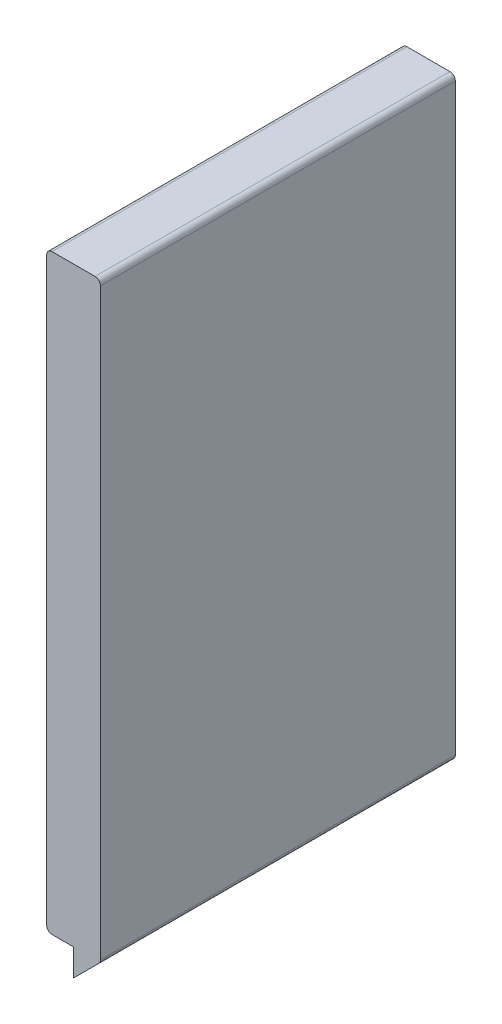
ISO-10303-21;
HEADER;
FILE_DESCRIPTION(('STEP AP214'),'2;1');
FILE_NAME('part.step','',(''),(''),'','','');
FILE_SCHEMA(('AUTOMOTIVE_DESIGN { 1 0 10303 214 1 1 1 1 }'));
ENDSEC;
DATA;
#1=APPLICATION_CONTEXT('core data for automotive mechanical design processes');
#2=APPLICATION_PROTOCOL_DEFINITION('international standard','automotive_design',2000,#1);
#3=PRODUCT_CONTEXT('',#1,'mechanical');
#4=PRODUCT('Part','Part','',(#3));
#5=PRODUCT_RELATED_PRODUCT_CATEGORY('part','',(#4));
#6=PRODUCT_DEFINITION_FORMATION('','',#4);
#7=PRODUCT_DEFINITION_CONTEXT('part definition',#1,'design');
#8=PRODUCT_DEFINITION('design','',#6,#7);
#9=PRODUCT_DEFINITION_SHAPE('','',#8);
#10=(LENGTH_UNIT() NAMED_UNIT(*) SI_UNIT(.MILLI.,.METRE.));
#11=(NAMED_UNIT(*) PLANE_ANGLE_UNIT() SI_UNIT($,.RADIAN.));
#12=(NAMED_UNIT(*) SI_UNIT($,.STERADIAN.) SOLID_ANGLE_UNIT());
#13=UNCERTAINTY_MEASURE_WITH_UNIT(LENGTH_MEASURE(1.E-05),#10,'distance_accuracy_value','');
#14=(GEOMETRIC_REPRESENTATION_CONTEXT(3) GLOBAL_UNCERTAINTY_ASSIGNED_CONTEXT((#13)) GLOBAL_UNIT_ASSIGNED_CONTEXT((#10,
#11,#12)) REPRESENTATION_CONTEXT('',''));
#15=CARTESIAN_POINT('',(0.,0.,0.));
#16=DIRECTION('',(0.,0.,1.));
#17=DIRECTION('',(1.,0.,0.));
#18=AXIS2_PLACEMENT_3D('',#15,#16,#17);
#19=CARTESIAN_POINT('',(10.,-55.,33.));
#20=DIRECTION('',(-1.,0.,0.));
#21=DIRECTION('',(0.,-1.,0.));
#22=AXIS2_PLACEMENT_3D('',#19,#20,#21);
#23=PLANE('',#22);
#24=DIRECTION('',(0.,1.,0.));
#25=VECTOR('',#24,1.);
#26=CARTESIAN_POINT('',(10.,-55.,-33.));
#27=LINE('',#26,#25);
#28=CARTESIAN_POINT('',(10.,-54.5857864376269,-33.));
#29=VERTEX_POINT('',#28);
#30=CARTESIAN_POINT('',(10.,54.,-33.));
#31=VERTEX_POINT('',#30);
#32=EDGE_CURVE('E149',#29,#31,#27,.T.);
#33=ORIENTED_EDGE('',*,*,#32,.T.);
#34=DIRECTION('',(0.,0.,-1.));
#35=VECTOR('',#34,1.);
#36=CARTESIAN_POINT('',(10.,54.,33.));
#37=LINE('',#36,#35);
#38=CARTESIAN_POINT('',(10.,54.,33.));
#39=VERTEX_POINT('',#38);
#40=EDGE_CURVE('E194',#31,#39,#37,.F.);
#41=ORIENTED_EDGE('',*,*,#40,.T.);
#42=DIRECTION('',(0.,1.,0.));
#43=VECTOR('',#42,1.);
#44=CARTESIAN_POINT('',(10.,-55.,33.));
#45=LINE('',#44,#43);
#46=CARTESIAN_POINT('',(10.,-54.5857864376269,33.));
#47=VERTEX_POINT('',#46);
#48=EDGE_CURVE('E169',#47,#39,#45,.T.);
#49=ORIENTED_EDGE('',*,*,#48,.F.);
#50=DIRECTION('',(0.,0.,-1.));
#51=VECTOR('',#50,1.);
#52=CARTESIAN_POINT('',(10.,-54.5857864376269,33.));
#53=LINE('',#52,#51);
#54=EDGE_CURVE('E190',#47,#29,#53,.T.);
#55=ORIENTED_EDGE('',*,*,#54,.T.);
#56=EDGE_LOOP('',(#33,#41,#49,#55));
#57=FACE_BOUND('',#56,.T.);
#58=ADVANCED_FACE('F39',(#57),#23,.F.);
#59=CARTESIAN_POINT('',(10.,55.,33.));
#60=DIRECTION('',(0.,-1.,0.));
#61=DIRECTION('',(0.,0.,-1.));
#62=AXIS2_PLACEMENT_3D('',#59,#60,#61);
#63=PLANE('',#62);
#64=DIRECTION('',(-1.,0.,0.));
#65=VECTOR('',#64,1.);
#66=CARTESIAN_POINT('',(10.,55.,33.));
#67=LINE('',#66,#65);
#68=CARTESIAN_POINT('',(9.00000000000001,55.,33.));
#69=VERTEX_POINT('',#68);
#70=CARTESIAN_POINT('',(0.999999999999975,55.,33.));
#71=VERTEX_POINT('',#70);
#72=EDGE_CURVE('E228',#69,#71,#67,.T.);
#73=ORIENTED_EDGE('',*,*,#72,.F.);
#74=DIRECTION('',(0.,0.,-1.));
#75=VECTOR('',#74,1.);
#76=CARTESIAN_POINT('',(9.00000000000001,55.,33.));
#77=LINE('',#76,#75);
#78=CARTESIAN_POINT('',(9.00000000000001,55.,-33.));
#79=VERTEX_POINT('',#78);
#80=EDGE_CURVE('E174',#69,#79,#77,.T.);
#81=ORIENTED_EDGE('',*,*,#80,.T.);
#82=DIRECTION('',(-1.,0.,0.));
#83=VECTOR('',#82,1.);
#84=CARTESIAN_POINT('',(10.,55.,-33.));
#85=LINE('',#84,#83);
#86=CARTESIAN_POINT('',(0.999999999999975,55.,-33.));
#87=VERTEX_POINT('',#86);
#88=EDGE_CURVE('E153',#79,#87,#85,.T.);
#89=ORIENTED_EDGE('',*,*,#88,.T.);
#90=DIRECTION('',(0.,0.,-1.));
#91=VECTOR('',#90,1.);
#92=CARTESIAN_POINT('',(0.999999999999975,55.,33.));
#93=LINE('',#92,#91);
#94=EDGE_CURVE('E137',#87,#71,#93,.F.);
#95=ORIENTED_EDGE('',*,*,#94,.T.);
#96=EDGE_LOOP('',(#73,#81,#89,#95));
#97=FACE_BOUND('',#96,.T.);
#98=ADVANCED_FACE('F244',(#97),#63,.F.);
#99=CARTESIAN_POINT('',(0.,55.,33.));
#100=DIRECTION('',(1.,0.,0.));
#101=DIRECTION('',(0.,1.,0.));
#102=AXIS2_PLACEMENT_3D('',#99,#100,#101);
#103=PLANE('',#102);
#104=DIRECTION('',(0.,-1.,0.));
#105=VECTOR('',#104,1.);
#106=CARTESIAN_POINT('',(0.,55.,33.));
#107=LINE('',#106,#105);
#108=CARTESIAN_POINT('',(0.,54.,33.));
#109=VERTEX_POINT('',#108);
#110=CARTESIAN_POINT('',(0.,-54.,33.));
#111=VERTEX_POINT('',#110);
#112=EDGE_CURVE('E127',#109,#111,#107,.T.);
#113=ORIENTED_EDGE('',*,*,#112,.F.);
#114=DIRECTION('',(0.,0.,-1.));
#115=VECTOR('',#114,1.);
#116=CARTESIAN_POINT('',(0.,54.,33.));
#117=LINE('',#116,#115);
#118=CARTESIAN_POINT('',(0.,54.,-33.));
#119=VERTEX_POINT('',#118);
#120=EDGE_CURVE('E48',#109,#119,#117,.T.);
#121=ORIENTED_EDGE('',*,*,#120,.T.);
#122=DIRECTION('',(0.,-1.,0.));
#123=VECTOR('',#122,1.);
#124=CARTESIAN_POINT('',(0.,55.,-33.));
#125=LINE('',#124,#123);
#126=CARTESIAN_POINT('',(0.,-54.,-33.));
#127=VERTEX_POINT('',#126);
#128=EDGE_CURVE('E157',#119,#127,#125,.T.);
#129=ORIENTED_EDGE('',*,*,#128,.T.);
#130=DIRECTION('',(0.,0.,-1.));
#131=VECTOR('',#130,1.);
#132=CARTESIAN_POINT('',(0.,-54.,33.));
#133=LINE('',#132,#131);
#134=EDGE_CURVE('E210',#127,#111,#133,.F.);
#135=ORIENTED_EDGE('',*,*,#134,.T.);
#136=EDGE_LOOP('',(#113,#121,#129,#135));
#137=FACE_BOUND('',#136,.T.);
#138=ADVANCED_FACE('F218',(#137),#103,.F.);
#139=CARTESIAN_POINT('',(0.,-55.,33.));
#140=DIRECTION('',(0.,1.,0.));
#141=DIRECTION('',(0.,0.,1.));
#142=AXIS2_PLACEMENT_3D('',#139,#140,#141);
#143=PLANE('',#142);
#144=DIRECTION('',(1.,0.,0.));
#145=VECTOR('',#144,1.);
#146=CARTESIAN_POINT('',(0.,-55.,33.));
#147=LINE('',#146,#145);
#148=CARTESIAN_POINT('',(1.00000000000001,-55.,33.));
#149=VERTEX_POINT('',#148);
#150=CARTESIAN_POINT('',(5.00000000000001,-55.,33.));
#151=VERTEX_POINT('',#150);
#152=EDGE_CURVE('E117',#149,#151,#147,.T.);
#153=ORIENTED_EDGE('',*,*,#152,.F.);
#154=DIRECTION('',(0.,0.,-1.));
#155=VECTOR('',#154,1.);
#156=CARTESIAN_POINT('',(1.00000000000001,-55.,33.));
#157=LINE('',#156,#155);
#158=CARTESIAN_POINT('',(1.00000000000001,-55.,-33.));
#159=VERTEX_POINT('',#158);
#160=EDGE_CURVE('E11',#149,#159,#157,.T.);
#161=ORIENTED_EDGE('',*,*,#160,.T.);
#162=DIRECTION('',(1.,0.,0.));
#163=VECTOR('',#162,1.);
#164=CARTESIAN_POINT('',(0.,-55.,-33.));
#165=LINE('',#164,#163);
#166=CARTESIAN_POINT('',(5.00000000000001,-55.,-33.));
#167=VERTEX_POINT('',#166);
#168=EDGE_CURVE('E133',#159,#167,#165,.T.);
#169=ORIENTED_EDGE('',*,*,#168,.T.);
#170=DIRECTION('',(0.,0.,-1.));
#171=VECTOR('',#170,1.);
#172=CARTESIAN_POINT('',(5.00000000000001,-55.,33.));
#173=LINE('',#172,#171);
#174=EDGE_CURVE('E130',#151,#167,#173,.T.);
#175=ORIENTED_EDGE('',*,*,#174,.F.);
#176=EDGE_LOOP('',(#153,#161,#169,#175));
#177=FACE_BOUND('',#176,.T.);
#178=ADVANCED_FACE('F131',(#177),#143,.F.);
#179=CARTESIAN_POINT('',(5.00000000000001,-55.,33.));
#180=DIRECTION('',(1.,0.,0.));
#181=DIRECTION('',(0.,1.,0.));
#182=AXIS2_PLACEMENT_3D('',#179,#180,#181);
#183=PLANE('',#182);
#184=DIRECTION('',(0.,-1.,0.));
#185=VECTOR('',#184,1.);
#186=CARTESIAN_POINT('',(5.00000000000001,-55.,-33.));
#187=LINE('',#186,#185);
#188=CARTESIAN_POINT('',(5.00000000000001,-60.,-33.));
#189=VERTEX_POINT('',#188);
#190=EDGE_CURVE('E163',#167,#189,#187,.T.);
#191=ORIENTED_EDGE('',*,*,#190,.T.);
#192=DIRECTION('',(0.,0.,-1.));
#193=VECTOR('',#192,1.);
#194=CARTESIAN_POINT('',(5.00000000000001,-60.,33.));
#195=LINE('',#194,#193);
#196=CARTESIAN_POINT('',(5.00000000000001,-60.,33.));
#197=VERTEX_POINT('',#196);
#198=EDGE_CURVE('E138',#197,#189,#195,.T.);
#199=ORIENTED_EDGE('',*,*,#198,.F.);
#200=DIRECTION('',(0.,-1.,0.));
#201=VECTOR('',#200,1.);
#202=CARTESIAN_POINT('',(5.00000000000001,-55.,33.));
#203=LINE('',#202,#201);
#204=EDGE_CURVE('E122',#151,#197,#203,.T.);
#205=ORIENTED_EDGE('',*,*,#204,.F.);
#206=ORIENTED_EDGE('',*,*,#174,.T.);
#207=EDGE_LOOP('',(#191,#199,#205,#206));
#208=FACE_BOUND('',#207,.T.);
#209=ADVANCED_FACE('F140',(#208),#183,.F.);
#210=CARTESIAN_POINT('',(5.00000000000001,-60.,33.));
#211=DIRECTION('',(-0.707106781186546,0.707106781186549,0.));
#212=DIRECTION('',(-0.707106781186549,-0.707106781186546,0.));
#213=AXIS2_PLACEMENT_3D('',#210,#211,#212);
#214=PLANE('',#213);
#215=DIRECTION('',(0.707106781186549,0.707106781186546,0.));
#216=VECTOR('',#215,1.);
#217=CARTESIAN_POINT('',(5.00000000000001,-60.,-33.));
#218=LINE('',#217,#216);
#219=CARTESIAN_POINT('',(9.70710678118655,-55.2928932188135,-33.));
#220=VERTEX_POINT('',#219);
#221=EDGE_CURVE('E166',#189,#220,#218,.T.);
#222=ORIENTED_EDGE('',*,*,#221,.T.);
#223=DIRECTION('',(0.,0.,-1.));
#224=VECTOR('',#223,1.);
#225=CARTESIAN_POINT('',(9.70710678118655,-55.2928932188135,33.));
#226=LINE('',#225,#224);
#227=CARTESIAN_POINT('',(9.70710678118655,-55.2928932188135,33.));
#228=VERTEX_POINT('',#227);
#229=EDGE_CURVE('E55',#220,#228,#226,.F.);
#230=ORIENTED_EDGE('',*,*,#229,.T.);
#231=DIRECTION('',(0.707106781186549,0.707106781186546,0.));
#232=VECTOR('',#231,1.);
#233=CARTESIAN_POINT('',(5.00000000000001,-60.,33.));
#234=LINE('',#233,#232);
#235=EDGE_CURVE('E143',#197,#228,#234,.T.);
#236=ORIENTED_EDGE('',*,*,#235,.F.);
#237=ORIENTED_EDGE('',*,*,#198,.T.);
#238=EDGE_LOOP('',(#222,#230,#236,#237));
#239=FACE_BOUND('',#238,.T.);
#240=ADVANCED_FACE('F250',(#239),#214,.F.);
#241=CARTESIAN_POINT('',(0.,0.,33.));
#242=DIRECTION('',(0.,0.,1.));
#243=DIRECTION('',(1.,0.,0.));
#244=AXIS2_PLACEMENT_3D('',#241,#242,#243);
#245=PLANE('',#244);
#246=ORIENTED_EDGE('',*,*,#48,.T.);
#247=CARTESIAN_POINT('',(9.00000000000001,54.,33.));
#248=DIRECTION('',(0.,0.,1.));
#249=DIRECTION('',(1.,0.,0.));
#250=AXIS2_PLACEMENT_3D('',#247,#248,#249);
#251=CIRCLE('',#250,1.);
#252=EDGE_CURVE('E205',#39,#69,#251,.T.);
#253=ORIENTED_EDGE('',*,*,#252,.T.);
#254=ORIENTED_EDGE('',*,*,#72,.T.);
#255=CARTESIAN_POINT('',(0.999999999999975,54.,33.));
#256=DIRECTION('',(0.,0.,1.));
#257=DIRECTION('',(1.,0.,0.));
#258=AXIS2_PLACEMENT_3D('',#255,#256,#257);
#259=CIRCLE('',#258,1.);
#260=EDGE_CURVE('E199',#71,#109,#259,.T.);
#261=ORIENTED_EDGE('',*,*,#260,.T.);
#262=ORIENTED_EDGE('',*,*,#112,.T.);
#263=CARTESIAN_POINT('',(1.00000000000001,-54.,33.));
#264=DIRECTION('',(0.,0.,1.));
#265=DIRECTION('',(1.,0.,0.));
#266=AXIS2_PLACEMENT_3D('',#263,#264,#265);
#267=CIRCLE('',#266,1.);
#268=EDGE_CURVE('E63',#111,#149,#267,.T.);
#269=ORIENTED_EDGE('',*,*,#268,.T.);
#270=ORIENTED_EDGE('',*,*,#152,.T.);
#271=ORIENTED_EDGE('',*,*,#204,.T.);
#272=ORIENTED_EDGE('',*,*,#235,.T.);
#273=CARTESIAN_POINT('',(9.00000000000001,-54.5857864376269,33.));
#274=DIRECTION('',(0.,0.,1.));
#275=DIRECTION('',(1.,0.,0.));
#276=AXIS2_PLACEMENT_3D('',#273,#274,#275);
#277=CIRCLE('',#276,1.);
#278=EDGE_CURVE('E202',#228,#47,#277,.T.);
#279=ORIENTED_EDGE('',*,*,#278,.T.);
#280=EDGE_LOOP('',(#246,#253,#254,#261,#262,#269,#270,#271,#272,#279));
#281=FACE_BOUND('',#280,.T.);
#282=ADVANCED_FACE('F120',(#281),#245,.T.);
#283=CARTESIAN_POINT('',(0.,0.,-33.));
#284=DIRECTION('',(0.,0.,1.));
#285=DIRECTION('',(1.,0.,0.));
#286=AXIS2_PLACEMENT_3D('',#283,#284,#285);
#287=PLANE('',#286);
#288=ORIENTED_EDGE('',*,*,#88,.F.);
#289=CARTESIAN_POINT('',(9.00000000000001,54.,-33.));
#290=DIRECTION('',(0.,0.,1.));
#291=DIRECTION('',(1.,0.,0.));
#292=AXIS2_PLACEMENT_3D('',#289,#290,#291);
#293=CIRCLE('',#292,1.);
#294=EDGE_CURVE('E187',#79,#31,#293,.F.);
#295=ORIENTED_EDGE('',*,*,#294,.T.);
#296=ORIENTED_EDGE('',*,*,#32,.F.);
#297=CARTESIAN_POINT('',(9.00000000000001,-54.5857864376269,-33.));
#298=DIRECTION('',(0.,0.,1.));
#299=DIRECTION('',(1.,0.,0.));
#300=AXIS2_PLACEMENT_3D('',#297,#298,#299);
#301=CIRCLE('',#300,1.);
#302=EDGE_CURVE('E184',#29,#220,#301,.F.);
#303=ORIENTED_EDGE('',*,*,#302,.T.);
#304=ORIENTED_EDGE('',*,*,#221,.F.);
#305=ORIENTED_EDGE('',*,*,#190,.F.);
#306=ORIENTED_EDGE('',*,*,#168,.F.);
#307=CARTESIAN_POINT('',(1.00000000000001,-54.,-33.));
#308=DIRECTION('',(0.,0.,1.));
#309=DIRECTION('',(1.,0.,0.));
#310=AXIS2_PLACEMENT_3D('',#307,#308,#309);
#311=CIRCLE('',#310,1.);
#312=EDGE_CURVE('E178',#159,#127,#311,.F.);
#313=ORIENTED_EDGE('',*,*,#312,.T.);
#314=ORIENTED_EDGE('',*,*,#128,.F.);
#315=CARTESIAN_POINT('',(0.999999999999975,54.,-33.));
#316=DIRECTION('',(0.,0.,1.));
#317=DIRECTION('',(1.,0.,0.));
#318=AXIS2_PLACEMENT_3D('',#315,#316,#317);
#319=CIRCLE('',#318,1.);
#320=EDGE_CURVE('E181',#119,#87,#319,.F.);
#321=ORIENTED_EDGE('',*,*,#320,.T.);
#322=EDGE_LOOP('',(#288,#295,#296,#303,#304,#305,#306,#313,#314,#321));
#323=FACE_BOUND('',#322,.T.);
#324=ADVANCED_FACE('F224',(#323),#287,.F.);
#325=CARTESIAN_POINT('',(9.00000000000001,54.,33.));
#326=DIRECTION('',(0.,0.,-1.));
#327=DIRECTION('',(-1.,0.,0.));
#328=AXIS2_PLACEMENT_3D('',#325,#326,#327);
#329=CYLINDRICAL_SURFACE('',#328,1.);
#330=ORIENTED_EDGE('',*,*,#252,.F.);
#331=ORIENTED_EDGE('',*,*,#40,.F.);
#332=ORIENTED_EDGE('',*,*,#294,.F.);
#333=ORIENTED_EDGE('',*,*,#80,.F.);
#334=EDGE_LOOP('',(#330,#331,#332,#333));
#335=FACE_BOUND('',#334,.T.);
#336=ADVANCED_FACE('F242',(#335),#329,.T.);
#337=CARTESIAN_POINT('',(9.00000000000001,-54.5857864376269,33.));
#338=DIRECTION('',(0.,0.,-1.));
#339=DIRECTION('',(-1.,0.,0.));
#340=AXIS2_PLACEMENT_3D('',#337,#338,#339);
#341=CYLINDRICAL_SURFACE('',#340,1.);
#342=ORIENTED_EDGE('',*,*,#278,.F.);
#343=ORIENTED_EDGE('',*,*,#229,.F.);
#344=ORIENTED_EDGE('',*,*,#302,.F.);
#345=ORIENTED_EDGE('',*,*,#54,.F.);
#346=EDGE_LOOP('',(#342,#343,#344,#345));
#347=FACE_BOUND('',#346,.T.);
#348=ADVANCED_FACE('F248',(#347),#341,.T.);
#349=CARTESIAN_POINT('',(0.999999999999975,54.,33.));
#350=DIRECTION('',(0.,0.,-1.));
#351=DIRECTION('',(-1.,0.,0.));
#352=AXIS2_PLACEMENT_3D('',#349,#350,#351);
#353=CYLINDRICAL_SURFACE('',#352,1.);
#354=ORIENTED_EDGE('',*,*,#260,.F.);
#355=ORIENTED_EDGE('',*,*,#94,.F.);
#356=ORIENTED_EDGE('',*,*,#320,.F.);
#357=ORIENTED_EDGE('',*,*,#120,.F.);
#358=EDGE_LOOP('',(#354,#355,#356,#357));
#359=FACE_BOUND('',#358,.T.);
#360=ADVANCED_FACE('F271',(#359),#353,.T.);
#361=CARTESIAN_POINT('',(1.00000000000001,-54.,33.));
#362=DIRECTION('',(0.,0.,-1.));
#363=DIRECTION('',(-1.,0.,0.));
#364=AXIS2_PLACEMENT_3D('',#361,#362,#363);
#365=CYLINDRICAL_SURFACE('',#364,1.);
#366=ORIENTED_EDGE('',*,*,#268,.F.);
#367=ORIENTED_EDGE('',*,*,#134,.F.);
#368=ORIENTED_EDGE('',*,*,#312,.F.);
#369=ORIENTED_EDGE('',*,*,#160,.F.);
#370=EDGE_LOOP('',(#366,#367,#368,#369));
#371=FACE_BOUND('',#370,.T.);
#372=ADVANCED_FACE('F41',(#371),#365,.T.);
#373=CLOSED_SHELL('',(#58,#98,#138,#178,#209,#240,#282,#324,#336,#348,#360,#372));
#374=MANIFOLD_SOLID_BREP('B2',#373);
#375=ADVANCED_BREP_SHAPE_REPRESENTATION('',(#18,#374),#14);
#376=SHAPE_DEFINITION_REPRESENTATION(#9,#375);
ENDSEC;
END-ISO-10303-21;
